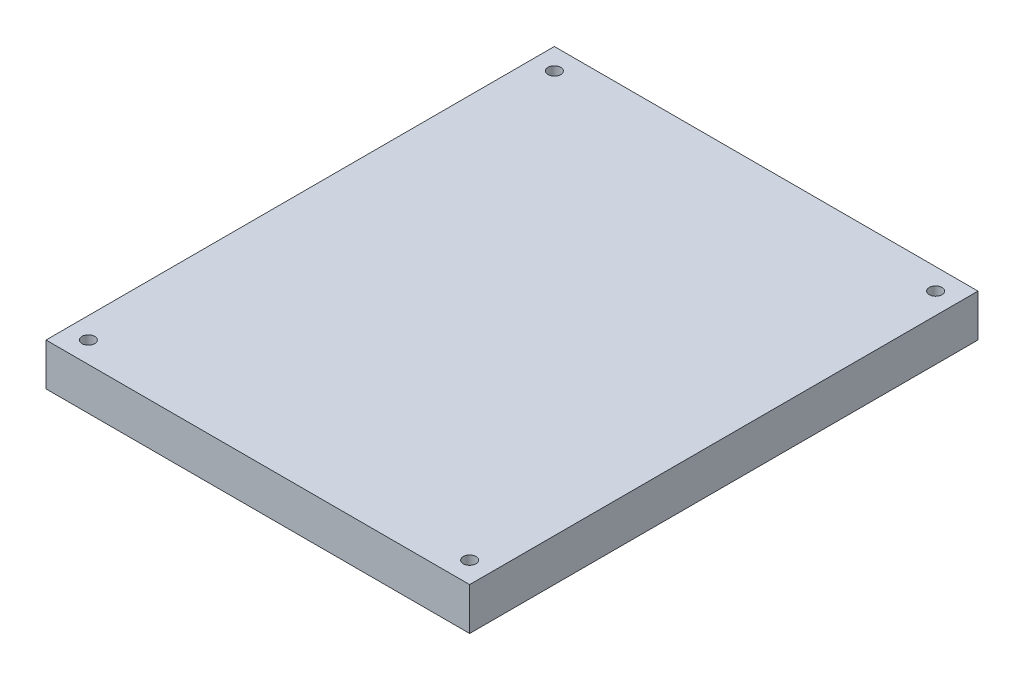
ISO-10303-21;
HEADER;
FILE_DESCRIPTION(('STEP AP214'),'2;1');
FILE_NAME('part.step','',(''),(''),'','','');
FILE_SCHEMA(('AUTOMOTIVE_DESIGN { 1 0 10303 214 1 1 1 1 }'));
ENDSEC;
DATA;
#1=APPLICATION_CONTEXT('core data for automotive mechanical design processes');
#2=APPLICATION_PROTOCOL_DEFINITION('international standard','automotive_design',2000,#1);
#3=PRODUCT_CONTEXT('',#1,'mechanical');
#4=PRODUCT('Part','Part','',(#3));
#5=PRODUCT_RELATED_PRODUCT_CATEGORY('part','',(#4));
#6=PRODUCT_DEFINITION_FORMATION('','',#4);
#7=PRODUCT_DEFINITION_CONTEXT('part definition',#1,'design');
#8=PRODUCT_DEFINITION('design','',#6,#7);
#9=PRODUCT_DEFINITION_SHAPE('','',#8);
#10=(LENGTH_UNIT() NAMED_UNIT(*) SI_UNIT(.MILLI.,.METRE.));
#11=(NAMED_UNIT(*) PLANE_ANGLE_UNIT() SI_UNIT($,.RADIAN.));
#12=(NAMED_UNIT(*) SI_UNIT($,.STERADIAN.) SOLID_ANGLE_UNIT());
#13=UNCERTAINTY_MEASURE_WITH_UNIT(LENGTH_MEASURE(1.E-05),#10,'distance_accuracy_value','');
#14=(GEOMETRIC_REPRESENTATION_CONTEXT(3) GLOBAL_UNCERTAINTY_ASSIGNED_CONTEXT((#13)) GLOBAL_UNIT_ASSIGNED_CONTEXT((#10,
#11,#12)) REPRESENTATION_CONTEXT('',''));
#15=CARTESIAN_POINT('',(0.,0.,0.));
#16=DIRECTION('',(0.,0.,1.));
#17=DIRECTION('',(1.,0.,0.));
#18=AXIS2_PLACEMENT_3D('',#15,#16,#17);
#19=CARTESIAN_POINT('',(-4.43349753694581,10.,-4.65517241379311));
#20=DIRECTION('',(1.,0.,0.));
#21=DIRECTION('',(0.,0.,-1.));
#22=AXIS2_PLACEMENT_3D('',#19,#20,#21);
#23=PLANE('',#22);
#24=DIRECTION('',(0.,0.,1.));
#25=VECTOR('',#24,1.);
#26=CARTESIAN_POINT('',(-4.43349753694581,0.,-4.65517241379311));
#27=LINE('',#26,#25);
#28=CARTESIAN_POINT('',(-4.43349753694581,0.,-4.65517241379311));
#29=VERTEX_POINT('',#28);
#30=CARTESIAN_POINT('',(-4.4334975369458,0.,115.344827586207));
#31=VERTEX_POINT('',#30);
#32=EDGE_CURVE('E96',#29,#31,#27,.T.);
#33=ORIENTED_EDGE('',*,*,#32,.T.);
#34=DIRECTION('',(0.,-1.,0.));
#35=VECTOR('',#34,1.);
#36=CARTESIAN_POINT('',(-4.4334975369458,10.,115.344827586207));
#37=LINE('',#36,#35);
#38=CARTESIAN_POINT('',(-4.4334975369458,10.,115.344827586207));
#39=VERTEX_POINT('',#38);
#40=EDGE_CURVE('E11',#39,#31,#37,.T.);
#41=ORIENTED_EDGE('',*,*,#40,.F.);
#42=DIRECTION('',(0.,0.,1.));
#43=VECTOR('',#42,1.);
#44=CARTESIAN_POINT('',(-4.43349753694581,10.,-4.65517241379311));
#45=LINE('',#44,#43);
#46=CARTESIAN_POINT('',(-4.43349753694581,10.,-4.65517241379311));
#47=VERTEX_POINT('',#46);
#48=EDGE_CURVE('E84',#47,#39,#45,.T.);
#49=ORIENTED_EDGE('',*,*,#48,.F.);
#50=DIRECTION('',(0.,-1.,0.));
#51=VECTOR('',#50,1.);
#52=CARTESIAN_POINT('',(-4.43349753694581,10.,-4.65517241379311));
#53=LINE('',#52,#51);
#54=EDGE_CURVE('E92',#47,#29,#53,.T.);
#55=ORIENTED_EDGE('',*,*,#54,.T.);
#56=EDGE_LOOP('',(#33,#41,#49,#55));
#57=FACE_BOUND('',#56,.T.);
#58=ADVANCED_FACE('F33',(#57),#23,.F.);
#59=CARTESIAN_POINT('',(-4.4334975369458,10.,115.344827586207));
#60=DIRECTION('',(0.,0.,-1.));
#61=DIRECTION('',(-1.,0.,0.));
#62=AXIS2_PLACEMENT_3D('',#59,#60,#61);
#63=PLANE('',#62);
#64=DIRECTION('',(1.,0.,0.));
#65=VECTOR('',#64,1.);
#66=CARTESIAN_POINT('',(-4.4334975369458,0.,115.344827586207));
#67=LINE('',#66,#65);
#68=CARTESIAN_POINT('',(95.5665024630542,0.,115.344827586207));
#69=VERTEX_POINT('',#68);
#70=EDGE_CURVE('E88',#31,#69,#67,.T.);
#71=ORIENTED_EDGE('',*,*,#70,.T.);
#72=DIRECTION('',(0.,-1.,0.));
#73=VECTOR('',#72,1.);
#74=CARTESIAN_POINT('',(95.5665024630542,10.,115.344827586207));
#75=LINE('',#74,#73);
#76=CARTESIAN_POINT('',(95.5665024630542,10.,115.344827586207));
#77=VERTEX_POINT('',#76);
#78=EDGE_CURVE('E41',#77,#69,#75,.T.);
#79=ORIENTED_EDGE('',*,*,#78,.F.);
#80=DIRECTION('',(1.,0.,0.));
#81=VECTOR('',#80,1.);
#82=CARTESIAN_POINT('',(-4.4334975369458,10.,115.344827586207));
#83=LINE('',#82,#81);
#84=EDGE_CURVE('E79',#39,#77,#83,.T.);
#85=ORIENTED_EDGE('',*,*,#84,.F.);
#86=ORIENTED_EDGE('',*,*,#40,.T.);
#87=EDGE_LOOP('',(#71,#79,#85,#86));
#88=FACE_BOUND('',#87,.T.);
#89=ADVANCED_FACE('F87',(#88),#63,.F.);
#90=CARTESIAN_POINT('',(95.5665024630542,10.,-4.65517241379311));
#91=DIRECTION('',(-1.,0.,0.));
#92=DIRECTION('',(0.,0.,1.));
#93=AXIS2_PLACEMENT_3D('',#90,#91,#92);
#94=PLANE('',#93);
#95=DIRECTION('',(0.,0.,-1.));
#96=VECTOR('',#95,1.);
#97=CARTESIAN_POINT('',(95.5665024630542,0.,-4.65517241379311));
#98=LINE('',#97,#96);
#99=CARTESIAN_POINT('',(95.5665024630542,0.,-4.65517241379311));
#100=VERTEX_POINT('',#99);
#101=EDGE_CURVE('E66',#69,#100,#98,.T.);
#102=ORIENTED_EDGE('',*,*,#101,.T.);
#103=DIRECTION('',(0.,-1.,0.));
#104=VECTOR('',#103,1.);
#105=CARTESIAN_POINT('',(95.5665024630542,10.,-4.65517241379311));
#106=LINE('',#105,#104);
#107=CARTESIAN_POINT('',(95.5665024630542,10.,-4.65517241379311));
#108=VERTEX_POINT('',#107);
#109=EDGE_CURVE('E89',#108,#100,#106,.T.);
#110=ORIENTED_EDGE('',*,*,#109,.F.);
#111=DIRECTION('',(0.,0.,-1.));
#112=VECTOR('',#111,1.);
#113=CARTESIAN_POINT('',(95.5665024630542,10.,-4.65517241379311));
#114=LINE('',#113,#112);
#115=EDGE_CURVE('E82',#77,#108,#114,.T.);
#116=ORIENTED_EDGE('',*,*,#115,.F.);
#117=ORIENTED_EDGE('',*,*,#78,.T.);
#118=EDGE_LOOP('',(#102,#110,#116,#117));
#119=FACE_BOUND('',#118,.T.);
#120=ADVANCED_FACE('F90',(#119),#94,.F.);
#121=CARTESIAN_POINT('',(-4.43349753694581,10.,-4.65517241379311));
#122=DIRECTION('',(0.,0.,1.));
#123=DIRECTION('',(1.,0.,0.));
#124=AXIS2_PLACEMENT_3D('',#121,#122,#123);
#125=PLANE('',#124);
#126=DIRECTION('',(-1.,0.,0.));
#127=VECTOR('',#126,1.);
#128=CARTESIAN_POINT('',(-4.43349753694581,0.,-4.65517241379311));
#129=LINE('',#128,#127);
#130=EDGE_CURVE('E72',#100,#29,#129,.T.);
#131=ORIENTED_EDGE('',*,*,#130,.T.);
#132=ORIENTED_EDGE('',*,*,#54,.F.);
#133=DIRECTION('',(-1.,0.,0.));
#134=VECTOR('',#133,1.);
#135=CARTESIAN_POINT('',(-4.43349753694581,10.,-4.65517241379311));
#136=LINE('',#135,#134);
#137=EDGE_CURVE('E49',#108,#47,#136,.T.);
#138=ORIENTED_EDGE('',*,*,#137,.F.);
#139=ORIENTED_EDGE('',*,*,#109,.T.);
#140=EDGE_LOOP('',(#131,#132,#138,#139));
#141=FACE_BOUND('',#140,.T.);
#142=ADVANCED_FACE('F104',(#141),#125,.F.);
#143=CARTESIAN_POINT('',(0.,10.,0.));
#144=DIRECTION('',(0.,1.,0.));
#145=DIRECTION('',(0.,0.,1.));
#146=AXIS2_PLACEMENT_3D('',#143,#144,#145);
#147=PLANE('',#146);
#148=CARTESIAN_POINT('',(0.566502463054195,10.,110.344827586207));
#149=DIRECTION('',(0.,1.,0.));
#150=DIRECTION('',(0.,0.,-1.));
#151=AXIS2_PLACEMENT_3D('',#148,#149,#150);
#152=CIRCLE('',#151,1.5);
#153=CARTESIAN_POINT('',(0.566502463054195,10.,108.844827586207));
#154=VERTEX_POINT('',#153);
#155=EDGE_CURVE('E128',#154,#154,#152,.T.);
#156=ORIENTED_EDGE('',*,*,#155,.F.);
#157=EDGE_LOOP('',(#156));
#158=FACE_BOUND('',#157,.T.);
#159=CARTESIAN_POINT('',(90.5665024630542,10.,110.344827586207));
#160=DIRECTION('',(0.,1.,0.));
#161=DIRECTION('',(0.,0.,1.));
#162=AXIS2_PLACEMENT_3D('',#159,#160,#161);
#163=CIRCLE('',#162,1.5);
#164=CARTESIAN_POINT('',(90.5665024630542,10.,111.844827586207));
#165=VERTEX_POINT('',#164);
#166=EDGE_CURVE('E122',#165,#165,#163,.T.);
#167=ORIENTED_EDGE('',*,*,#166,.F.);
#168=EDGE_LOOP('',(#167));
#169=FACE_BOUND('',#168,.T.);
#170=CARTESIAN_POINT('',(90.5665024630542,10.,0.344827586206879));
#171=DIRECTION('',(0.,1.,0.));
#172=DIRECTION('',(0.,0.,-1.));
#173=AXIS2_PLACEMENT_3D('',#170,#171,#172);
#174=CIRCLE('',#173,1.5);
#175=CARTESIAN_POINT('',(90.5665024630542,10.,-1.15517241379312));
#176=VERTEX_POINT('',#175);
#177=EDGE_CURVE('E116',#176,#176,#174,.T.);
#178=ORIENTED_EDGE('',*,*,#177,.F.);
#179=EDGE_LOOP('',(#178));
#180=FACE_BOUND('',#179,.T.);
#181=CARTESIAN_POINT('',(0.566502463054188,10.,0.344827586206894));
#182=DIRECTION('',(0.,1.,0.));
#183=DIRECTION('',(0.,0.,1.));
#184=AXIS2_PLACEMENT_3D('',#181,#182,#183);
#185=CIRCLE('',#184,1.5);
#186=CARTESIAN_POINT('',(0.566502463054188,10.,1.84482758620689));
#187=VERTEX_POINT('',#186);
#188=EDGE_CURVE('E110',#187,#187,#185,.T.);
#189=ORIENTED_EDGE('',*,*,#188,.F.);
#190=EDGE_LOOP('',(#189));
#191=FACE_BOUND('',#190,.T.);
#192=ORIENTED_EDGE('',*,*,#48,.T.);
#193=ORIENTED_EDGE('',*,*,#84,.T.);
#194=ORIENTED_EDGE('',*,*,#115,.T.);
#195=ORIENTED_EDGE('',*,*,#137,.T.);
#196=EDGE_LOOP('',(#192,#193,#194,#195));
#197=FACE_BOUND('',#196,.T.);
#198=ADVANCED_FACE('F80',(#158,#169,#180,#191,#197),#147,.T.);
#199=CARTESIAN_POINT('',(0.,0.,0.));
#200=DIRECTION('',(0.,1.,0.));
#201=DIRECTION('',(0.,0.,1.));
#202=AXIS2_PLACEMENT_3D('',#199,#200,#201);
#203=PLANE('',#202);
#204=CARTESIAN_POINT('',(0.566502463054195,0.,110.344827586207));
#205=DIRECTION('',(0.,1.,0.));
#206=DIRECTION('',(0.,0.,-1.));
#207=AXIS2_PLACEMENT_3D('',#204,#205,#206);
#208=CIRCLE('',#207,1.5);
#209=CARTESIAN_POINT('',(0.566502463054195,0.,108.844827586207));
#210=VERTEX_POINT('',#209);
#211=EDGE_CURVE('E125',#210,#210,#208,.T.);
#212=ORIENTED_EDGE('',*,*,#211,.T.);
#213=EDGE_LOOP('',(#212));
#214=FACE_BOUND('',#213,.T.);
#215=CARTESIAN_POINT('',(90.5665024630542,0.,110.344827586207));
#216=DIRECTION('',(0.,1.,0.));
#217=DIRECTION('',(0.,0.,1.));
#218=AXIS2_PLACEMENT_3D('',#215,#216,#217);
#219=CIRCLE('',#218,1.5);
#220=CARTESIAN_POINT('',(90.5665024630542,0.,111.844827586207));
#221=VERTEX_POINT('',#220);
#222=EDGE_CURVE('E119',#221,#221,#219,.T.);
#223=ORIENTED_EDGE('',*,*,#222,.T.);
#224=EDGE_LOOP('',(#223));
#225=FACE_BOUND('',#224,.T.);
#226=CARTESIAN_POINT('',(90.5665024630542,0.,0.344827586206879));
#227=DIRECTION('',(0.,1.,0.));
#228=DIRECTION('',(0.,0.,-1.));
#229=AXIS2_PLACEMENT_3D('',#226,#227,#228);
#230=CIRCLE('',#229,1.5);
#231=CARTESIAN_POINT('',(90.5665024630542,0.,-1.15517241379312));
#232=VERTEX_POINT('',#231);
#233=EDGE_CURVE('E113',#232,#232,#230,.T.);
#234=ORIENTED_EDGE('',*,*,#233,.T.);
#235=EDGE_LOOP('',(#234));
#236=FACE_BOUND('',#235,.T.);
#237=CARTESIAN_POINT('',(0.566502463054188,0.,0.344827586206894));
#238=DIRECTION('',(0.,1.,0.));
#239=DIRECTION('',(0.,0.,1.));
#240=AXIS2_PLACEMENT_3D('',#237,#238,#239);
#241=CIRCLE('',#240,1.5);
#242=CARTESIAN_POINT('',(0.566502463054188,0.,1.84482758620689));
#243=VERTEX_POINT('',#242);
#244=EDGE_CURVE('E99',#243,#243,#241,.T.);
#245=ORIENTED_EDGE('',*,*,#244,.T.);
#246=EDGE_LOOP('',(#245));
#247=FACE_BOUND('',#246,.T.);
#248=ORIENTED_EDGE('',*,*,#32,.F.);
#249=ORIENTED_EDGE('',*,*,#130,.F.);
#250=ORIENTED_EDGE('',*,*,#101,.F.);
#251=ORIENTED_EDGE('',*,*,#70,.F.);
#252=EDGE_LOOP('',(#248,#249,#250,#251));
#253=FACE_BOUND('',#252,.T.);
#254=ADVANCED_FACE('F107',(#214,#225,#236,#247,#253),#203,.F.);
#255=CARTESIAN_POINT('',(0.566502463054188,0.,0.344827586206894));
#256=DIRECTION('',(0.,1.,0.));
#257=DIRECTION('',(0.,0.,1.));
#258=AXIS2_PLACEMENT_3D('',#255,#256,#257);
#259=CYLINDRICAL_SURFACE('',#258,1.5);
#260=ORIENTED_EDGE('',*,*,#244,.F.);
#261=EDGE_LOOP('',(#260));
#262=FACE_BOUND('',#261,.T.);
#263=ORIENTED_EDGE('',*,*,#188,.T.);
#264=EDGE_LOOP('',(#263));
#265=FACE_BOUND('',#264,.T.);
#266=ADVANCED_FACE('F152',(#262,#265),#259,.F.);
#267=CARTESIAN_POINT('',(90.5665024630542,0.,0.344827586206879));
#268=DIRECTION('',(0.,1.,0.));
#269=DIRECTION('',(0.,0.,1.));
#270=AXIS2_PLACEMENT_3D('',#267,#268,#269);
#271=CYLINDRICAL_SURFACE('',#270,1.5);
#272=ORIENTED_EDGE('',*,*,#233,.F.);
#273=EDGE_LOOP('',(#272));
#274=FACE_BOUND('',#273,.T.);
#275=ORIENTED_EDGE('',*,*,#177,.T.);
#276=EDGE_LOOP('',(#275));
#277=FACE_BOUND('',#276,.T.);
#278=ADVANCED_FACE('F154',(#274,#277),#271,.F.);
#279=CARTESIAN_POINT('',(90.5665024630542,0.,110.344827586207));
#280=DIRECTION('',(0.,1.,0.));
#281=DIRECTION('',(0.,0.,1.));
#282=AXIS2_PLACEMENT_3D('',#279,#280,#281);
#283=CYLINDRICAL_SURFACE('',#282,1.5);
#284=ORIENTED_EDGE('',*,*,#222,.F.);
#285=EDGE_LOOP('',(#284));
#286=FACE_BOUND('',#285,.T.);
#287=ORIENTED_EDGE('',*,*,#166,.T.);
#288=EDGE_LOOP('',(#287));
#289=FACE_BOUND('',#288,.T.);
#290=ADVANCED_FACE('F139',(#286,#289),#283,.F.);
#291=CARTESIAN_POINT('',(0.566502463054195,0.,110.344827586207));
#292=DIRECTION('',(0.,1.,0.));
#293=DIRECTION('',(0.,0.,1.));
#294=AXIS2_PLACEMENT_3D('',#291,#292,#293);
#295=CYLINDRICAL_SURFACE('',#294,1.5);
#296=ORIENTED_EDGE('',*,*,#211,.F.);
#297=EDGE_LOOP('',(#296));
#298=FACE_BOUND('',#297,.T.);
#299=ORIENTED_EDGE('',*,*,#155,.T.);
#300=EDGE_LOOP('',(#299));
#301=FACE_BOUND('',#300,.T.);
#302=ADVANCED_FACE('F136',(#298,#301),#295,.F.);
#303=CLOSED_SHELL('',(#58,#89,#120,#142,#198,#254,#266,#278,#290,#302));
#304=MANIFOLD_SOLID_BREP('B2',#303);
#305=ADVANCED_BREP_SHAPE_REPRESENTATION('',(#18,#304),#14);
#306=SHAPE_DEFINITION_REPRESENTATION(#9,#305);
ENDSEC;
END-ISO-10303-21;
